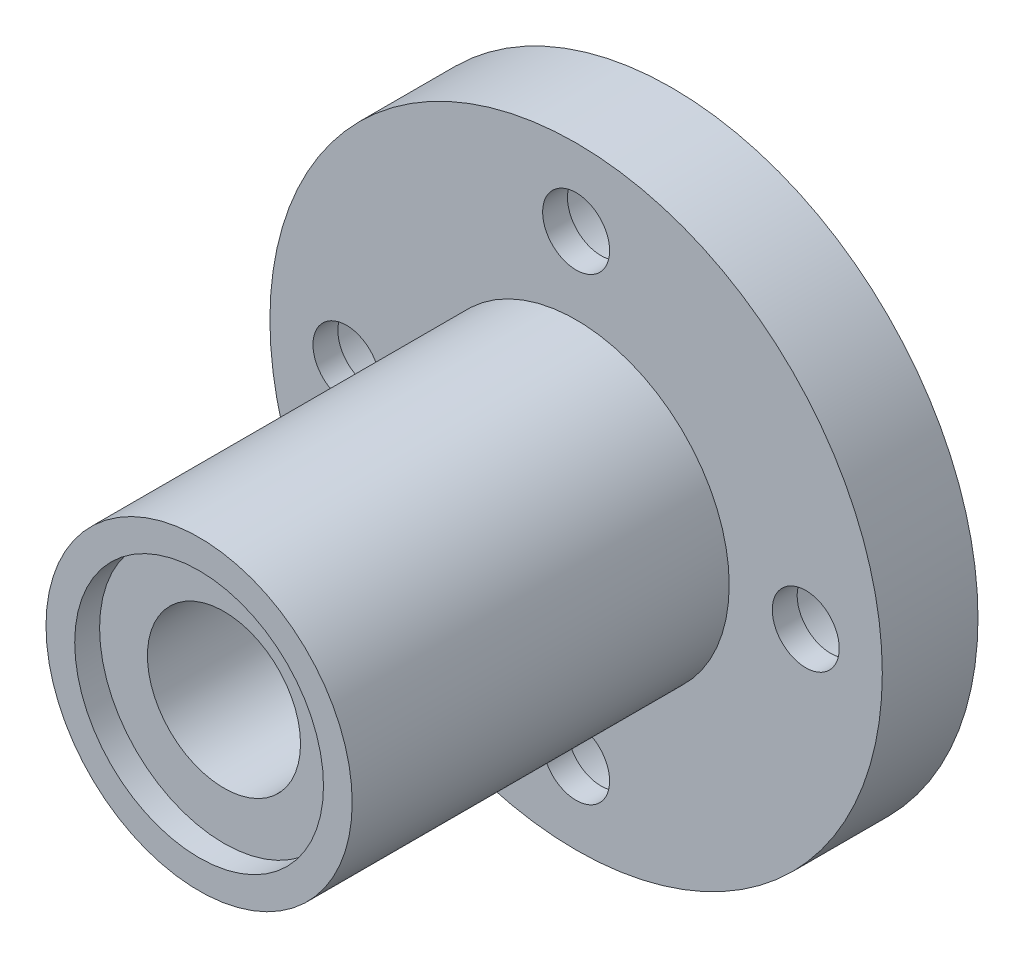
ISO-10303-21;
HEADER;
FILE_DESCRIPTION(('STEP AP214'),'2;1');
FILE_NAME('part.step','',(''),(''),'','','');
FILE_SCHEMA(('AUTOMOTIVE_DESIGN { 1 0 10303 214 1 1 1 1 }'));
ENDSEC;
DATA;
#1=APPLICATION_CONTEXT('core data for automotive mechanical design processes');
#2=APPLICATION_PROTOCOL_DEFINITION('international standard','automotive_design',2000,#1);
#3=PRODUCT_CONTEXT('',#1,'mechanical');
#4=PRODUCT('Part','Part','',(#3));
#5=PRODUCT_RELATED_PRODUCT_CATEGORY('part','',(#4));
#6=PRODUCT_DEFINITION_FORMATION('','',#4);
#7=PRODUCT_DEFINITION_CONTEXT('part definition',#1,'design');
#8=PRODUCT_DEFINITION('design','',#6,#7);
#9=PRODUCT_DEFINITION_SHAPE('','',#8);
#10=(LENGTH_UNIT() NAMED_UNIT(*) SI_UNIT(.MILLI.,.METRE.));
#11=(NAMED_UNIT(*) PLANE_ANGLE_UNIT() SI_UNIT($,.RADIAN.));
#12=(NAMED_UNIT(*) SI_UNIT($,.STERADIAN.) SOLID_ANGLE_UNIT());
#13=UNCERTAINTY_MEASURE_WITH_UNIT(LENGTH_MEASURE(1.E-05),#10,'distance_accuracy_value','');
#14=(GEOMETRIC_REPRESENTATION_CONTEXT(3) GLOBAL_UNCERTAINTY_ASSIGNED_CONTEXT((#13)) GLOBAL_UNIT_ASSIGNED_CONTEXT((#10,
#11,#12)) REPRESENTATION_CONTEXT('',''));
#15=CARTESIAN_POINT('',(0.,0.,0.));
#16=DIRECTION('',(0.,0.,1.));
#17=DIRECTION('',(1.,0.,0.));
#18=AXIS2_PLACEMENT_3D('',#15,#16,#17);
#19=CARTESIAN_POINT('',(0.,0.,-0.001000000000001));
#20=DIRECTION('',(0.,0.,1.));
#21=DIRECTION('',(1.,0.,0.));
#22=AXIS2_PLACEMENT_3D('',#19,#20,#21);
#23=CYLINDRICAL_SURFACE('',#22,4.);
#24=CARTESIAN_POINT('',(0.,0.,1.3));
#25=DIRECTION('',(0.,0.,1.));
#26=DIRECTION('',(1.,0.,0.));
#27=AXIS2_PLACEMENT_3D('',#24,#25,#26);
#28=CIRCLE('',#27,4.);
#29=CARTESIAN_POINT('',(4.,0.,1.3));
#30=VERTEX_POINT('',#29);
#31=EDGE_CURVE('E38',#30,#30,#28,.F.);
#32=ORIENTED_EDGE('',*,*,#31,.T.);
#33=EDGE_LOOP('',(#32));
#34=FACE_BOUND('',#33,.T.);
#35=CARTESIAN_POINT('',(0.,0.,23.4));
#36=DIRECTION('',(0.,0.,1.));
#37=DIRECTION('',(1.,0.,0.));
#38=AXIS2_PLACEMENT_3D('',#35,#36,#37);
#39=CIRCLE('',#38,4.);
#40=CARTESIAN_POINT('',(4.,0.,23.4));
#41=VERTEX_POINT('',#40);
#42=EDGE_CURVE('E54',#41,#41,#39,.F.);
#43=ORIENTED_EDGE('',*,*,#42,.F.);
#44=EDGE_LOOP('',(#43));
#45=FACE_BOUND('',#44,.T.);
#46=ADVANCED_FACE('F34',(#34,#45),#23,.F.);
#47=CARTESIAN_POINT('',(12.,0.,24.701));
#48=DIRECTION('',(0.,0.,-1.));
#49=DIRECTION('',(-1.,0.,0.));
#50=AXIS2_PLACEMENT_3D('',#47,#48,#49);
#51=CYLINDRICAL_SURFACE('',#50,1.75);
#52=CARTESIAN_POINT('',(12.,0.,5.));
#53=DIRECTION('',(0.,0.,1.));
#54=DIRECTION('',(1.,0.,0.));
#55=AXIS2_PLACEMENT_3D('',#52,#53,#54);
#56=CIRCLE('',#55,1.75);
#57=CARTESIAN_POINT('',(13.75,0.,5.));
#58=VERTEX_POINT('',#57);
#59=EDGE_CURVE('E82',#58,#58,#56,.F.);
#60=ORIENTED_EDGE('',*,*,#59,.F.);
#61=EDGE_LOOP('',(#60));
#62=FACE_BOUND('',#61,.T.);
#63=CARTESIAN_POINT('',(12.,0.,3.7));
#64=DIRECTION('',(0.,0.,-1.));
#65=DIRECTION('',(-1.,0.,0.));
#66=AXIS2_PLACEMENT_3D('',#63,#64,#65);
#67=CIRCLE('',#66,1.75);
#68=CARTESIAN_POINT('',(10.25,0.,3.7));
#69=VERTEX_POINT('',#68);
#70=EDGE_CURVE('E56',#69,#69,#67,.T.);
#71=ORIENTED_EDGE('',*,*,#70,.T.);
#72=EDGE_LOOP('',(#71));
#73=FACE_BOUND('',#72,.T.);
#74=ADVANCED_FACE('F121',(#62,#73),#51,.F.);
#75=CARTESIAN_POINT('',(0.,-12.,24.701));
#76=DIRECTION('',(0.,0.,-1.));
#77=DIRECTION('',(-1.,0.,0.));
#78=AXIS2_PLACEMENT_3D('',#75,#76,#77);
#79=CYLINDRICAL_SURFACE('',#78,1.75);
#80=CARTESIAN_POINT('',(0.,-12.,5.));
#81=DIRECTION('',(0.,0.,1.));
#82=DIRECTION('',(1.,0.,0.));
#83=AXIS2_PLACEMENT_3D('',#80,#81,#82);
#84=CIRCLE('',#83,1.75);
#85=CARTESIAN_POINT('',(1.75,-12.,5.));
#86=VERTEX_POINT('',#85);
#87=EDGE_CURVE('E113',#86,#86,#84,.F.);
#88=ORIENTED_EDGE('',*,*,#87,.F.);
#89=EDGE_LOOP('',(#88));
#90=FACE_BOUND('',#89,.T.);
#91=CARTESIAN_POINT('',(0.,-12.,3.7));
#92=DIRECTION('',(0.,0.,-1.));
#93=DIRECTION('',(-1.,0.,0.));
#94=AXIS2_PLACEMENT_3D('',#91,#92,#93);
#95=CIRCLE('',#94,1.75);
#96=CARTESIAN_POINT('',(-1.75,-12.,3.7));
#97=VERTEX_POINT('',#96);
#98=EDGE_CURVE('E94',#97,#97,#95,.T.);
#99=ORIENTED_EDGE('',*,*,#98,.T.);
#100=EDGE_LOOP('',(#99));
#101=FACE_BOUND('',#100,.T.);
#102=ADVANCED_FACE('F124',(#90,#101),#79,.F.);
#103=CARTESIAN_POINT('',(-12.,0.,24.701));
#104=DIRECTION('',(0.,0.,-1.));
#105=DIRECTION('',(-1.,0.,0.));
#106=AXIS2_PLACEMENT_3D('',#103,#104,#105);
#107=CYLINDRICAL_SURFACE('',#106,1.75);
#108=CARTESIAN_POINT('',(-12.,0.,5.));
#109=DIRECTION('',(0.,0.,1.));
#110=DIRECTION('',(1.,0.,0.));
#111=AXIS2_PLACEMENT_3D('',#108,#109,#110);
#112=CIRCLE('',#111,1.75);
#113=CARTESIAN_POINT('',(-10.25,0.,5.));
#114=VERTEX_POINT('',#113);
#115=EDGE_CURVE('E110',#114,#114,#112,.F.);
#116=ORIENTED_EDGE('',*,*,#115,.F.);
#117=EDGE_LOOP('',(#116));
#118=FACE_BOUND('',#117,.T.);
#119=CARTESIAN_POINT('',(-12.,0.,3.7));
#120=DIRECTION('',(0.,0.,-1.));
#121=DIRECTION('',(-1.,0.,0.));
#122=AXIS2_PLACEMENT_3D('',#119,#120,#121);
#123=CIRCLE('',#122,1.75);
#124=CARTESIAN_POINT('',(-13.75,0.,3.7));
#125=VERTEX_POINT('',#124);
#126=EDGE_CURVE('E85',#125,#125,#123,.T.);
#127=ORIENTED_EDGE('',*,*,#126,.T.);
#128=EDGE_LOOP('',(#127));
#129=FACE_BOUND('',#128,.T.);
#130=ADVANCED_FACE('F158',(#118,#129),#107,.F.);
#131=CARTESIAN_POINT('',(0.,12.,24.701));
#132=DIRECTION('',(0.,0.,-1.));
#133=DIRECTION('',(-1.,0.,0.));
#134=AXIS2_PLACEMENT_3D('',#131,#132,#133);
#135=CYLINDRICAL_SURFACE('',#134,1.75);
#136=CARTESIAN_POINT('',(0.,12.,5.));
#137=DIRECTION('',(0.,0.,1.));
#138=DIRECTION('',(1.,0.,0.));
#139=AXIS2_PLACEMENT_3D('',#136,#137,#138);
#140=CIRCLE('',#139,1.75);
#141=CARTESIAN_POINT('',(1.75,12.,5.));
#142=VERTEX_POINT('',#141);
#143=EDGE_CURVE('E107',#142,#142,#140,.F.);
#144=ORIENTED_EDGE('',*,*,#143,.F.);
#145=EDGE_LOOP('',(#144));
#146=FACE_BOUND('',#145,.T.);
#147=CARTESIAN_POINT('',(0.,12.,3.7));
#148=DIRECTION('',(0.,0.,-1.));
#149=DIRECTION('',(-1.,0.,0.));
#150=AXIS2_PLACEMENT_3D('',#147,#148,#149);
#151=CIRCLE('',#150,1.75);
#152=CARTESIAN_POINT('',(-1.75,12.,3.7));
#153=VERTEX_POINT('',#152);
#154=EDGE_CURVE('E74',#153,#153,#151,.T.);
#155=ORIENTED_EDGE('',*,*,#154,.T.);
#156=EDGE_LOOP('',(#155));
#157=FACE_BOUND('',#156,.T.);
#158=ADVANCED_FACE('F150',(#146,#157),#135,.F.);
#159=CARTESIAN_POINT('',(0.,0.,5.));
#160=DIRECTION('',(0.,0.,-1.));
#161=DIRECTION('',(-1.,0.,0.));
#162=AXIS2_PLACEMENT_3D('',#159,#160,#161);
#163=CYLINDRICAL_SURFACE('',#162,16.);
#164=CARTESIAN_POINT('',(0.,0.,5.));
#165=DIRECTION('',(0.,0.,1.));
#166=DIRECTION('',(1.,0.,0.));
#167=AXIS2_PLACEMENT_3D('',#164,#165,#166);
#168=CIRCLE('',#167,16.);
#169=CARTESIAN_POINT('',(16.,0.,5.));
#170=VERTEX_POINT('',#169);
#171=EDGE_CURVE('E42',#170,#170,#168,.T.);
#172=ORIENTED_EDGE('',*,*,#171,.F.);
#173=EDGE_LOOP('',(#172));
#174=FACE_BOUND('',#173,.T.);
#175=CARTESIAN_POINT('',(0.,0.,0.));
#176=DIRECTION('',(0.,0.,1.));
#177=DIRECTION('',(1.,0.,0.));
#178=AXIS2_PLACEMENT_3D('',#175,#176,#177);
#179=CIRCLE('',#178,16.);
#180=CARTESIAN_POINT('',(16.,0.,0.));
#181=VERTEX_POINT('',#180);
#182=EDGE_CURVE('E47',#181,#181,#179,.T.);
#183=ORIENTED_EDGE('',*,*,#182,.T.);
#184=EDGE_LOOP('',(#183));
#185=FACE_BOUND('',#184,.T.);
#186=ADVANCED_FACE('F36',(#174,#185),#163,.T.);
#187=CARTESIAN_POINT('',(0.,0.,5.));
#188=DIRECTION('',(0.,0.,1.));
#189=DIRECTION('',(1.,0.,0.));
#190=AXIS2_PLACEMENT_3D('',#187,#188,#189);
#191=PLANE('',#190);
#192=ORIENTED_EDGE('',*,*,#143,.T.);
#193=EDGE_LOOP('',(#192));
#194=FACE_BOUND('',#193,.T.);
#195=ORIENTED_EDGE('',*,*,#115,.T.);
#196=EDGE_LOOP('',(#195));
#197=FACE_BOUND('',#196,.T.);
#198=ORIENTED_EDGE('',*,*,#87,.T.);
#199=EDGE_LOOP('',(#198));
#200=FACE_BOUND('',#199,.T.);
#201=ORIENTED_EDGE('',*,*,#59,.T.);
#202=EDGE_LOOP('',(#201));
#203=FACE_BOUND('',#202,.T.);
#204=CARTESIAN_POINT('',(0.,0.,5.));
#205=DIRECTION('',(0.,0.,1.));
#206=DIRECTION('',(1.,0.,0.));
#207=AXIS2_PLACEMENT_3D('',#204,#205,#206);
#208=CIRCLE('',#207,8.);
#209=CARTESIAN_POINT('',(8.,0.,5.));
#210=VERTEX_POINT('',#209);
#211=EDGE_CURVE('E10',#210,#210,#208,.T.);
#212=ORIENTED_EDGE('',*,*,#211,.F.);
#213=EDGE_LOOP('',(#212));
#214=FACE_BOUND('',#213,.T.);
#215=ORIENTED_EDGE('',*,*,#171,.T.);
#216=EDGE_LOOP('',(#215));
#217=FACE_BOUND('',#216,.T.);
#218=ADVANCED_FACE('F118',(#194,#197,#200,#203,#214,#217),#191,.T.);
#219=CARTESIAN_POINT('',(0.,0.,0.));
#220=DIRECTION('',(0.,0.,1.));
#221=DIRECTION('',(1.,0.,0.));
#222=AXIS2_PLACEMENT_3D('',#219,#220,#221);
#223=PLANE('',#222);
#224=CARTESIAN_POINT('',(0.,0.,0.));
#225=DIRECTION('',(0.,0.,1.));
#226=DIRECTION('',(1.,0.,0.));
#227=AXIS2_PLACEMENT_3D('',#224,#225,#226);
#228=CIRCLE('',#227,6.5);
#229=CARTESIAN_POINT('',(6.5,0.,0.));
#230=VERTEX_POINT('',#229);
#231=EDGE_CURVE('E71',#230,#230,#228,.T.);
#232=ORIENTED_EDGE('',*,*,#231,.T.);
#233=EDGE_LOOP('',(#232));
#234=FACE_BOUND('',#233,.T.);
#235=CARTESIAN_POINT('',(0.,12.,0.));
#236=DIRECTION('',(0.,0.,-1.));
#237=DIRECTION('',(-1.,0.,0.));
#238=AXIS2_PLACEMENT_3D('',#235,#236,#237);
#239=CIRCLE('',#238,3.25);
#240=CARTESIAN_POINT('',(-3.25,12.,0.));
#241=VERTEX_POINT('',#240);
#242=EDGE_CURVE('E77',#241,#241,#239,.T.);
#243=ORIENTED_EDGE('',*,*,#242,.F.);
#244=EDGE_LOOP('',(#243));
#245=FACE_BOUND('',#244,.T.);
#246=CARTESIAN_POINT('',(-12.,0.,0.));
#247=DIRECTION('',(0.,0.,-1.));
#248=DIRECTION('',(-1.,0.,0.));
#249=AXIS2_PLACEMENT_3D('',#246,#247,#248);
#250=CIRCLE('',#249,3.25);
#251=CARTESIAN_POINT('',(-15.25,0.,0.));
#252=VERTEX_POINT('',#251);
#253=EDGE_CURVE('E88',#252,#252,#250,.T.);
#254=ORIENTED_EDGE('',*,*,#253,.F.);
#255=EDGE_LOOP('',(#254));
#256=FACE_BOUND('',#255,.T.);
#257=CARTESIAN_POINT('',(0.,-12.,0.));
#258=DIRECTION('',(0.,0.,-1.));
#259=DIRECTION('',(-1.,0.,0.));
#260=AXIS2_PLACEMENT_3D('',#257,#258,#259);
#261=CIRCLE('',#260,3.25);
#262=CARTESIAN_POINT('',(-3.25,-12.,0.));
#263=VERTEX_POINT('',#262);
#264=EDGE_CURVE('E97',#263,#263,#261,.T.);
#265=ORIENTED_EDGE('',*,*,#264,.F.);
#266=EDGE_LOOP('',(#265));
#267=FACE_BOUND('',#266,.T.);
#268=CARTESIAN_POINT('',(12.,0.,0.));
#269=DIRECTION('',(0.,0.,-1.));
#270=DIRECTION('',(-1.,0.,0.));
#271=AXIS2_PLACEMENT_3D('',#268,#269,#270);
#272=CIRCLE('',#271,3.25);
#273=CARTESIAN_POINT('',(8.75,0.,0.));
#274=VERTEX_POINT('',#273);
#275=EDGE_CURVE('E61',#274,#274,#272,.T.);
#276=ORIENTED_EDGE('',*,*,#275,.F.);
#277=EDGE_LOOP('',(#276));
#278=FACE_BOUND('',#277,.T.);
#279=ORIENTED_EDGE('',*,*,#182,.F.);
#280=EDGE_LOOP('',(#279));
#281=FACE_BOUND('',#280,.T.);
#282=ADVANCED_FACE('F142',(#234,#245,#256,#267,#278,#281),#223,.F.);
#283=CARTESIAN_POINT('',(0.,0.,24.7));
#284=DIRECTION('',(0.,0.,-1.));
#285=DIRECTION('',(-1.,0.,0.));
#286=AXIS2_PLACEMENT_3D('',#283,#284,#285);
#287=CYLINDRICAL_SURFACE('',#286,8.);
#288=CARTESIAN_POINT('',(0.,0.,24.7));
#289=DIRECTION('',(0.,0.,1.));
#290=DIRECTION('',(1.,0.,0.));
#291=AXIS2_PLACEMENT_3D('',#288,#289,#290);
#292=CIRCLE('',#291,8.);
#293=CARTESIAN_POINT('',(8.,0.,24.7));
#294=VERTEX_POINT('',#293);
#295=EDGE_CURVE('E50',#294,#294,#292,.T.);
#296=ORIENTED_EDGE('',*,*,#295,.F.);
#297=EDGE_LOOP('',(#296));
#298=FACE_BOUND('',#297,.T.);
#299=ORIENTED_EDGE('',*,*,#211,.T.);
#300=EDGE_LOOP('',(#299));
#301=FACE_BOUND('',#300,.T.);
#302=ADVANCED_FACE('F145',(#298,#301),#287,.T.);
#303=CARTESIAN_POINT('',(0.,0.,24.7));
#304=DIRECTION('',(0.,0.,1.));
#305=DIRECTION('',(1.,0.,0.));
#306=AXIS2_PLACEMENT_3D('',#303,#304,#305);
#307=PLANE('',#306);
#308=CARTESIAN_POINT('',(0.,0.,24.7));
#309=DIRECTION('',(0.,0.,1.));
#310=DIRECTION('',(1.,0.,0.));
#311=AXIS2_PLACEMENT_3D('',#308,#309,#310);
#312=CIRCLE('',#311,6.5);
#313=CARTESIAN_POINT('',(6.5,0.,24.7));
#314=VERTEX_POINT('',#313);
#315=EDGE_CURVE('E64',#314,#314,#312,.T.);
#316=ORIENTED_EDGE('',*,*,#315,.F.);
#317=EDGE_LOOP('',(#316));
#318=FACE_BOUND('',#317,.T.);
#319=ORIENTED_EDGE('',*,*,#295,.T.);
#320=EDGE_LOOP('',(#319));
#321=FACE_BOUND('',#320,.T.);
#322=ADVANCED_FACE('F171',(#318,#321),#307,.T.);
#323=CARTESIAN_POINT('',(0.,12.,3.7));
#324=DIRECTION('',(0.,0.,-1.));
#325=DIRECTION('',(-1.,0.,0.));
#326=AXIS2_PLACEMENT_3D('',#323,#324,#325);
#327=CYLINDRICAL_SURFACE('',#326,3.25);
#328=CARTESIAN_POINT('',(0.,12.,3.7));
#329=DIRECTION('',(0.,0.,-1.));
#330=DIRECTION('',(-1.,0.,0.));
#331=AXIS2_PLACEMENT_3D('',#328,#329,#330);
#332=CIRCLE('',#331,3.25);
#333=CARTESIAN_POINT('',(-3.25,12.,3.7));
#334=VERTEX_POINT('',#333);
#335=EDGE_CURVE('E79',#334,#334,#332,.T.);
#336=ORIENTED_EDGE('',*,*,#335,.F.);
#337=EDGE_LOOP('',(#336));
#338=FACE_BOUND('',#337,.T.);
#339=ORIENTED_EDGE('',*,*,#242,.T.);
#340=EDGE_LOOP('',(#339));
#341=FACE_BOUND('',#340,.T.);
#342=ADVANCED_FACE('F174',(#338,#341),#327,.F.);
#343=CARTESIAN_POINT('',(0.,12.,3.7));
#344=DIRECTION('',(0.,0.,-1.));
#345=DIRECTION('',(-1.,0.,0.));
#346=AXIS2_PLACEMENT_3D('',#343,#344,#345);
#347=PLANE('',#346);
#348=ORIENTED_EDGE('',*,*,#154,.F.);
#349=EDGE_LOOP('',(#348));
#350=FACE_BOUND('',#349,.T.);
#351=ORIENTED_EDGE('',*,*,#335,.T.);
#352=EDGE_LOOP('',(#351));
#353=FACE_BOUND('',#352,.T.);
#354=ADVANCED_FACE('F198',(#350,#353),#347,.T.);
#355=CARTESIAN_POINT('',(-12.,0.,3.7));
#356=DIRECTION('',(0.,0.,-1.));
#357=DIRECTION('',(-1.,0.,0.));
#358=AXIS2_PLACEMENT_3D('',#355,#356,#357);
#359=CYLINDRICAL_SURFACE('',#358,3.25);
#360=CARTESIAN_POINT('',(-12.,0.,3.7));
#361=DIRECTION('',(0.,0.,-1.));
#362=DIRECTION('',(-1.,0.,0.));
#363=AXIS2_PLACEMENT_3D('',#360,#361,#362);
#364=CIRCLE('',#363,3.25);
#365=CARTESIAN_POINT('',(-15.25,0.,3.7));
#366=VERTEX_POINT('',#365);
#367=EDGE_CURVE('E78',#366,#366,#364,.T.);
#368=ORIENTED_EDGE('',*,*,#367,.F.);
#369=EDGE_LOOP('',(#368));
#370=FACE_BOUND('',#369,.T.);
#371=ORIENTED_EDGE('',*,*,#253,.T.);
#372=EDGE_LOOP('',(#371));
#373=FACE_BOUND('',#372,.T.);
#374=ADVANCED_FACE('F207',(#370,#373),#359,.F.);
#375=CARTESIAN_POINT('',(-12.,0.,3.7));
#376=DIRECTION('',(0.,0.,-1.));
#377=DIRECTION('',(-1.,0.,0.));
#378=AXIS2_PLACEMENT_3D('',#375,#376,#377);
#379=PLANE('',#378);
#380=ORIENTED_EDGE('',*,*,#126,.F.);
#381=EDGE_LOOP('',(#380));
#382=FACE_BOUND('',#381,.T.);
#383=ORIENTED_EDGE('',*,*,#367,.T.);
#384=EDGE_LOOP('',(#383));
#385=FACE_BOUND('',#384,.T.);
#386=ADVANCED_FACE('F215',(#382,#385),#379,.T.);
#387=CARTESIAN_POINT('',(0.,-12.,3.7));
#388=DIRECTION('',(0.,0.,-1.));
#389=DIRECTION('',(-1.,0.,0.));
#390=AXIS2_PLACEMENT_3D('',#387,#388,#389);
#391=CYLINDRICAL_SURFACE('',#390,3.25);
#392=CARTESIAN_POINT('',(0.,-12.,3.7));
#393=DIRECTION('',(0.,0.,-1.));
#394=DIRECTION('',(-1.,0.,0.));
#395=AXIS2_PLACEMENT_3D('',#392,#393,#394);
#396=CIRCLE('',#395,3.25);
#397=CARTESIAN_POINT('',(-3.25,-12.,3.7));
#398=VERTEX_POINT('',#397);
#399=EDGE_CURVE('E89',#398,#398,#396,.T.);
#400=ORIENTED_EDGE('',*,*,#399,.F.);
#401=EDGE_LOOP('',(#400));
#402=FACE_BOUND('',#401,.T.);
#403=ORIENTED_EDGE('',*,*,#264,.T.);
#404=EDGE_LOOP('',(#403));
#405=FACE_BOUND('',#404,.T.);
#406=ADVANCED_FACE('F223',(#402,#405),#391,.F.);
#407=CARTESIAN_POINT('',(0.,-12.,3.7));
#408=DIRECTION('',(0.,0.,-1.));
#409=DIRECTION('',(-1.,0.,0.));
#410=AXIS2_PLACEMENT_3D('',#407,#408,#409);
#411=PLANE('',#410);
#412=ORIENTED_EDGE('',*,*,#98,.F.);
#413=EDGE_LOOP('',(#412));
#414=FACE_BOUND('',#413,.T.);
#415=ORIENTED_EDGE('',*,*,#399,.T.);
#416=EDGE_LOOP('',(#415));
#417=FACE_BOUND('',#416,.T.);
#418=ADVANCED_FACE('F138',(#414,#417),#411,.T.);
#419=CARTESIAN_POINT('',(12.,0.,3.7));
#420=DIRECTION('',(0.,0.,-1.));
#421=DIRECTION('',(-1.,0.,0.));
#422=AXIS2_PLACEMENT_3D('',#419,#420,#421);
#423=CYLINDRICAL_SURFACE('',#422,3.25);
#424=CARTESIAN_POINT('',(12.,0.,3.7));
#425=DIRECTION('',(0.,0.,-1.));
#426=DIRECTION('',(-1.,0.,0.));
#427=AXIS2_PLACEMENT_3D('',#424,#425,#426);
#428=CIRCLE('',#427,3.25);
#429=CARTESIAN_POINT('',(8.75,0.,3.7));
#430=VERTEX_POINT('',#429);
#431=EDGE_CURVE('E98',#430,#430,#428,.T.);
#432=ORIENTED_EDGE('',*,*,#431,.F.);
#433=EDGE_LOOP('',(#432));
#434=FACE_BOUND('',#433,.T.);
#435=ORIENTED_EDGE('',*,*,#275,.T.);
#436=EDGE_LOOP('',(#435));
#437=FACE_BOUND('',#436,.T.);
#438=ADVANCED_FACE('F132',(#434,#437),#423,.F.);
#439=CARTESIAN_POINT('',(12.,0.,3.7));
#440=DIRECTION('',(0.,0.,-1.));
#441=DIRECTION('',(-1.,0.,0.));
#442=AXIS2_PLACEMENT_3D('',#439,#440,#441);
#443=PLANE('',#442);
#444=ORIENTED_EDGE('',*,*,#70,.F.);
#445=EDGE_LOOP('',(#444));
#446=FACE_BOUND('',#445,.T.);
#447=ORIENTED_EDGE('',*,*,#431,.T.);
#448=EDGE_LOOP('',(#447));
#449=FACE_BOUND('',#448,.T.);
#450=ADVANCED_FACE('F128',(#446,#449),#443,.T.);
#451=CARTESIAN_POINT('',(0.,0.,23.4));
#452=DIRECTION('',(0.,0.,1.));
#453=DIRECTION('',(1.,0.,0.));
#454=AXIS2_PLACEMENT_3D('',#451,#452,#453);
#455=PLANE('',#454);
#456=CARTESIAN_POINT('',(0.,0.,23.4));
#457=DIRECTION('',(0.,0.,1.));
#458=DIRECTION('',(1.,0.,0.));
#459=AXIS2_PLACEMENT_3D('',#456,#457,#458);
#460=CIRCLE('',#459,6.5);
#461=CARTESIAN_POINT('',(6.5,0.,23.4));
#462=VERTEX_POINT('',#461);
#463=EDGE_CURVE('E57',#462,#462,#460,.T.);
#464=ORIENTED_EDGE('',*,*,#463,.T.);
#465=EDGE_LOOP('',(#464));
#466=FACE_BOUND('',#465,.T.);
#467=ORIENTED_EDGE('',*,*,#42,.T.);
#468=EDGE_LOOP('',(#467));
#469=FACE_BOUND('',#468,.T.);
#470=ADVANCED_FACE('F131',(#466,#469),#455,.T.);
#471=CARTESIAN_POINT('',(0.,0.,23.4));
#472=DIRECTION('',(0.,0.,1.));
#473=DIRECTION('',(1.,0.,0.));
#474=AXIS2_PLACEMENT_3D('',#471,#472,#473);
#475=CYLINDRICAL_SURFACE('',#474,6.5);
#476=ORIENTED_EDGE('',*,*,#463,.F.);
#477=EDGE_LOOP('',(#476));
#478=FACE_BOUND('',#477,.T.);
#479=ORIENTED_EDGE('',*,*,#315,.T.);
#480=EDGE_LOOP('',(#479));
#481=FACE_BOUND('',#480,.T.);
#482=ADVANCED_FACE('F252',(#478,#481),#475,.F.);
#483=CARTESIAN_POINT('',(0.,0.,1.3));
#484=DIRECTION('',(0.,0.,1.));
#485=DIRECTION('',(1.,0.,0.));
#486=AXIS2_PLACEMENT_3D('',#483,#484,#485);
#487=PLANE('',#486);
#488=CARTESIAN_POINT('',(0.,0.,1.3));
#489=DIRECTION('',(0.,0.,1.));
#490=DIRECTION('',(1.,0.,0.));
#491=AXIS2_PLACEMENT_3D('',#488,#489,#490);
#492=CIRCLE('',#491,6.5);
#493=CARTESIAN_POINT('',(6.5,0.,1.3));
#494=VERTEX_POINT('',#493);
#495=EDGE_CURVE('E377',#494,#494,#492,.T.);
#496=ORIENTED_EDGE('',*,*,#495,.F.);
#497=EDGE_LOOP('',(#496));
#498=FACE_BOUND('',#497,.T.);
#499=ORIENTED_EDGE('',*,*,#31,.F.);
#500=EDGE_LOOP('',(#499));
#501=FACE_BOUND('',#500,.T.);
#502=ADVANCED_FACE('F260',(#498,#501),#487,.F.);
#503=CARTESIAN_POINT('',(0.,0.,1.3));
#504=DIRECTION('',(0.,0.,-1.));
#505=DIRECTION('',(-1.,0.,0.));
#506=AXIS2_PLACEMENT_3D('',#503,#504,#505);
#507=CYLINDRICAL_SURFACE('',#506,6.5);
#508=ORIENTED_EDGE('',*,*,#495,.T.);
#509=EDGE_LOOP('',(#508));
#510=FACE_BOUND('',#509,.T.);
#511=ORIENTED_EDGE('',*,*,#231,.F.);
#512=EDGE_LOOP('',(#511));
#513=FACE_BOUND('',#512,.T.);
#514=ADVANCED_FACE('F267',(#510,#513),#507,.F.);
#515=CLOSED_SHELL('',(#46,#74,#102,#130,#158,#186,#218,#282,#302,#322,#342,#354,#374,#386,#406,
#418,#438,#450,#470,#482,#502,#514));
#516=MANIFOLD_SOLID_BREP('B2',#515);
#517=ADVANCED_BREP_SHAPE_REPRESENTATION('',(#18,#516),#14);
#518=SHAPE_DEFINITION_REPRESENTATION(#9,#517);
ENDSEC;
END-ISO-10303-21;
